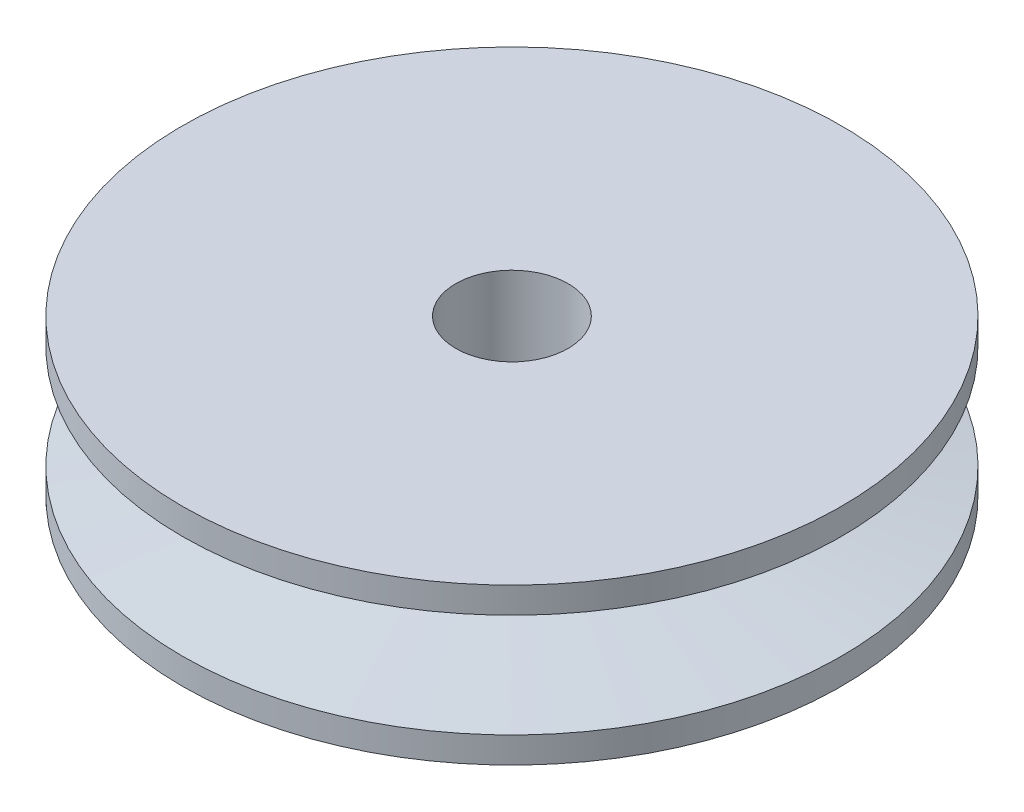
ISO-10303-21;
HEADER;
FILE_DESCRIPTION(('STEP AP214'),'2;1');
FILE_NAME('part.step','',(''),(''),'','','');
FILE_SCHEMA(('AUTOMOTIVE_DESIGN { 1 0 10303 214 1 1 1 1 }'));
ENDSEC;
DATA;
#1=APPLICATION_CONTEXT('core data for automotive mechanical design processes');
#2=APPLICATION_PROTOCOL_DEFINITION('international standard','automotive_design',2000,#1);
#3=PRODUCT_CONTEXT('',#1,'mechanical');
#4=PRODUCT('Part','Part','',(#3));
#5=PRODUCT_RELATED_PRODUCT_CATEGORY('part','',(#4));
#6=PRODUCT_DEFINITION_FORMATION('','',#4);
#7=PRODUCT_DEFINITION_CONTEXT('part definition',#1,'design');
#8=PRODUCT_DEFINITION('design','',#6,#7);
#9=PRODUCT_DEFINITION_SHAPE('','',#8);
#10=(LENGTH_UNIT() NAMED_UNIT(*) SI_UNIT(.MILLI.,.METRE.));
#11=(NAMED_UNIT(*) PLANE_ANGLE_UNIT() SI_UNIT($,.RADIAN.));
#12=(NAMED_UNIT(*) SI_UNIT($,.STERADIAN.) SOLID_ANGLE_UNIT());
#13=UNCERTAINTY_MEASURE_WITH_UNIT(LENGTH_MEASURE(1.E-05),#10,'distance_accuracy_value','');
#14=(GEOMETRIC_REPRESENTATION_CONTEXT(3) GLOBAL_UNCERTAINTY_ASSIGNED_CONTEXT((#13)) GLOBAL_UNIT_ASSIGNED_CONTEXT((#10,
#11,#12)) REPRESENTATION_CONTEXT('',''));
#15=CARTESIAN_POINT('',(0.,0.,0.));
#16=DIRECTION('',(0.,0.,1.));
#17=DIRECTION('',(1.,0.,0.));
#18=AXIS2_PLACEMENT_3D('',#15,#16,#17);
#19=CARTESIAN_POINT('',(0.,-19.7,0.));
#20=DIRECTION('',(0.,1.,0.));
#21=DIRECTION('',(0.,0.,1.));
#22=AXIS2_PLACEMENT_3D('',#19,#20,#21);
#23=PLANE('',#22);
#24=CARTESIAN_POINT('',(0.,-19.7,0.));
#25=DIRECTION('',(0.,1.,0.));
#26=DIRECTION('',(0.,0.,1.));
#27=AXIS2_PLACEMENT_3D('',#24,#25,#26);
#28=CIRCLE('',#27,7.1);
#29=CARTESIAN_POINT('',(0.,-19.7,7.1));
#30=VERTEX_POINT('',#29);
#31=EDGE_CURVE('E61',#30,#30,#28,.T.);
#32=ORIENTED_EDGE('',*,*,#31,.T.);
#33=EDGE_LOOP('',(#32));
#34=FACE_BOUND('',#33,.T.);
#35=CARTESIAN_POINT('',(0.,-19.7,0.));
#36=DIRECTION('',(0.,1.,0.));
#37=DIRECTION('',(0.,0.,1.));
#38=AXIS2_PLACEMENT_3D('',#35,#36,#37);
#39=CIRCLE('',#38,41.65);
#40=CARTESIAN_POINT('',(0.,-19.7,41.65));
#41=VERTEX_POINT('',#40);
#42=EDGE_CURVE('E10',#41,#41,#39,.T.);
#43=ORIENTED_EDGE('',*,*,#42,.F.);
#44=EDGE_LOOP('',(#43));
#45=FACE_BOUND('',#44,.T.);
#46=ADVANCED_FACE('F36',(#34,#45),#23,.F.);
#47=CARTESIAN_POINT('',(0.,0.,0.));
#48=DIRECTION('',(0.,1.,0.));
#49=DIRECTION('',(0.,0.,1.));
#50=AXIS2_PLACEMENT_3D('',#47,#48,#49);
#51=CYLINDRICAL_SURFACE('',#50,41.65);
#52=CARTESIAN_POINT('',(0.,-16.4,0.));
#53=DIRECTION('',(0.,1.,0.));
#54=DIRECTION('',(0.,0.,1.));
#55=AXIS2_PLACEMENT_3D('',#52,#53,#54);
#56=CIRCLE('',#55,41.65);
#57=CARTESIAN_POINT('',(0.,-16.4,41.65));
#58=VERTEX_POINT('',#57);
#59=EDGE_CURVE('E42',#58,#58,#56,.T.);
#60=ORIENTED_EDGE('',*,*,#59,.F.);
#61=EDGE_LOOP('',(#60));
#62=FACE_BOUND('',#61,.T.);
#63=ORIENTED_EDGE('',*,*,#42,.T.);
#64=EDGE_LOOP('',(#63));
#65=FACE_BOUND('',#64,.T.);
#66=ADVANCED_FACE('F102',(#62,#65),#51,.T.);
#67=CARTESIAN_POINT('',(0.,-16.4,0.));
#68=DIRECTION('',(0.,-1.,0.));
#69=DIRECTION('',(0.,0.,-1.));
#70=AXIS2_PLACEMENT_3D('',#67,#68,#69);
#71=CONICAL_SURFACE('',#70,41.65,1.40502667899621);
#72=CARTESIAN_POINT('',(0.,-13.2,0.));
#73=DIRECTION('',(0.,1.,0.));
#74=DIRECTION('',(0.,0.,1.));
#75=AXIS2_PLACEMENT_3D('',#72,#73,#74);
#76=CIRCLE('',#75,22.523249986455);
#77=CARTESIAN_POINT('',(0.,-13.2,22.523249986455));
#78=VERTEX_POINT('',#77);
#79=EDGE_CURVE('E46',#78,#78,#76,.T.);
#80=ORIENTED_EDGE('',*,*,#79,.F.);
#81=EDGE_LOOP('',(#80));
#82=FACE_BOUND('',#81,.T.);
#83=ORIENTED_EDGE('',*,*,#59,.T.);
#84=EDGE_LOOP('',(#83));
#85=FACE_BOUND('',#84,.T.);
#86=ADVANCED_FACE('F97',(#82,#85),#71,.T.);
#87=CARTESIAN_POINT('',(0.,0.,0.));
#88=DIRECTION('',(0.,1.,0.));
#89=DIRECTION('',(0.,0.,1.));
#90=AXIS2_PLACEMENT_3D('',#87,#88,#89);
#91=CYLINDRICAL_SURFACE('',#90,22.523249986455);
#92=CARTESIAN_POINT('',(0.,-6.5,0.));
#93=DIRECTION('',(0.,1.,0.));
#94=DIRECTION('',(0.,0.,1.));
#95=AXIS2_PLACEMENT_3D('',#92,#93,#94);
#96=CIRCLE('',#95,22.523249986455);
#97=CARTESIAN_POINT('',(0.,-6.50000000000001,22.523249986455));
#98=VERTEX_POINT('',#97);
#99=EDGE_CURVE('E50',#98,#98,#96,.T.);
#100=ORIENTED_EDGE('',*,*,#99,.F.);
#101=EDGE_LOOP('',(#100));
#102=FACE_BOUND('',#101,.T.);
#103=ORIENTED_EDGE('',*,*,#79,.T.);
#104=EDGE_LOOP('',(#103));
#105=FACE_BOUND('',#104,.T.);
#106=ADVANCED_FACE('F91',(#102,#105),#91,.T.);
#107=CARTESIAN_POINT('',(0.,-6.5,0.));
#108=DIRECTION('',(0.,1.,0.));
#109=DIRECTION('',(0.,0.,1.));
#110=AXIS2_PLACEMENT_3D('',#107,#108,#109);
#111=CONICAL_SURFACE('',#110,22.523249986455,1.40502667899621);
#112=CARTESIAN_POINT('',(0.,-3.30000000000001,0.));
#113=DIRECTION('',(0.,1.,0.));
#114=DIRECTION('',(0.,0.,1.));
#115=AXIS2_PLACEMENT_3D('',#112,#113,#114);
#116=CIRCLE('',#115,41.65);
#117=CARTESIAN_POINT('',(0.,-3.30000000000001,41.65));
#118=VERTEX_POINT('',#117);
#119=EDGE_CURVE('E55',#118,#118,#116,.T.);
#120=ORIENTED_EDGE('',*,*,#119,.F.);
#121=EDGE_LOOP('',(#120));
#122=FACE_BOUND('',#121,.T.);
#123=ORIENTED_EDGE('',*,*,#99,.T.);
#124=EDGE_LOOP('',(#123));
#125=FACE_BOUND('',#124,.T.);
#126=ADVANCED_FACE('F85',(#122,#125),#111,.T.);
#127=CARTESIAN_POINT('',(0.,0.,0.));
#128=DIRECTION('',(0.,1.,0.));
#129=DIRECTION('',(0.,0.,1.));
#130=AXIS2_PLACEMENT_3D('',#127,#128,#129);
#131=CYLINDRICAL_SURFACE('',#130,41.65);
#132=CARTESIAN_POINT('',(0.,0.,0.));
#133=DIRECTION('',(0.,1.,0.));
#134=DIRECTION('',(0.,0.,1.));
#135=AXIS2_PLACEMENT_3D('',#132,#133,#134);
#136=CIRCLE('',#135,41.65);
#137=CARTESIAN_POINT('',(0.,0.,41.65));
#138=VERTEX_POINT('',#137);
#139=EDGE_CURVE('E58',#138,#138,#136,.T.);
#140=ORIENTED_EDGE('',*,*,#139,.F.);
#141=EDGE_LOOP('',(#140));
#142=FACE_BOUND('',#141,.T.);
#143=ORIENTED_EDGE('',*,*,#119,.T.);
#144=EDGE_LOOP('',(#143));
#145=FACE_BOUND('',#144,.T.);
#146=ADVANCED_FACE('F79',(#142,#145),#131,.T.);
#147=CARTESIAN_POINT('',(0.,0.,0.));
#148=DIRECTION('',(0.,-1.,0.));
#149=DIRECTION('',(0.,0.,-1.));
#150=AXIS2_PLACEMENT_3D('',#147,#148,#149);
#151=PLANE('',#150);
#152=CARTESIAN_POINT('',(0.,0.,0.));
#153=DIRECTION('',(0.,1.,0.));
#154=DIRECTION('',(0.,0.,1.));
#155=AXIS2_PLACEMENT_3D('',#152,#153,#154);
#156=CIRCLE('',#155,7.1);
#157=CARTESIAN_POINT('',(0.,0.,7.1));
#158=VERTEX_POINT('',#157);
#159=EDGE_CURVE('E62',#158,#158,#156,.T.);
#160=ORIENTED_EDGE('',*,*,#159,.F.);
#161=EDGE_LOOP('',(#160));
#162=FACE_BOUND('',#161,.T.);
#163=ORIENTED_EDGE('',*,*,#139,.T.);
#164=EDGE_LOOP('',(#163));
#165=FACE_BOUND('',#164,.T.);
#166=ADVANCED_FACE('F73',(#162,#165),#151,.F.);
#167=CARTESIAN_POINT('',(0.,-19.7,0.));
#168=DIRECTION('',(0.,1.,0.));
#169=DIRECTION('',(0.,0.,1.));
#170=AXIS2_PLACEMENT_3D('',#167,#168,#169);
#171=CYLINDRICAL_SURFACE('',#170,7.1);
#172=ORIENTED_EDGE('',*,*,#31,.F.);
#173=EDGE_LOOP('',(#172));
#174=FACE_BOUND('',#173,.T.);
#175=ORIENTED_EDGE('',*,*,#159,.T.);
#176=EDGE_LOOP('',(#175));
#177=FACE_BOUND('',#176,.T.);
#178=ADVANCED_FACE('F70',(#174,#177),#171,.F.);
#179=CLOSED_SHELL('',(#46,#66,#86,#106,#126,#146,#166,#178));
#180=MANIFOLD_SOLID_BREP('B2',#179);
#181=ADVANCED_BREP_SHAPE_REPRESENTATION('',(#18,#180),#14);
#182=SHAPE_DEFINITION_REPRESENTATION(#9,#181);
ENDSEC;
END-ISO-10303-21;
